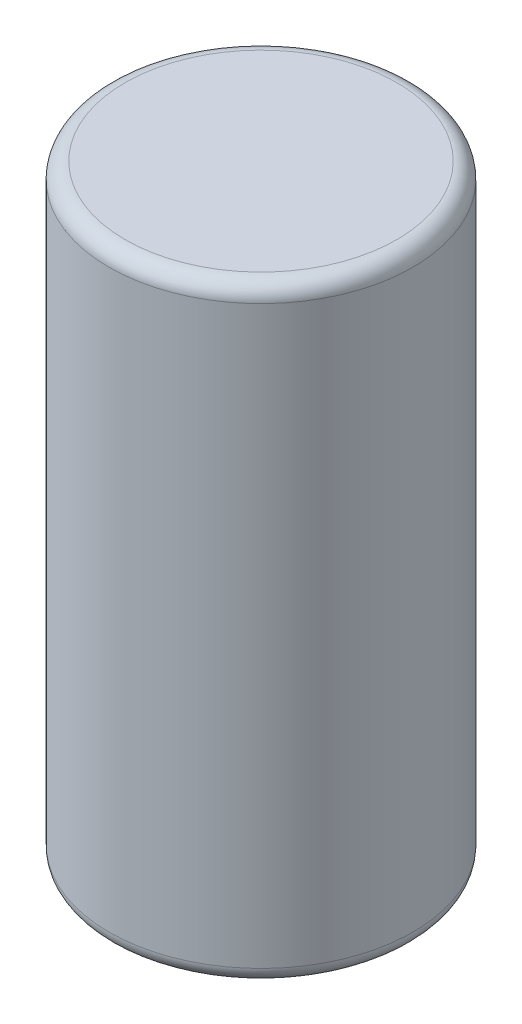
ISO-10303-21;
HEADER;
FILE_DESCRIPTION(('STEP AP214'),'2;1');
FILE_NAME('part.step','',(''),(''),'','','');
FILE_SCHEMA(('AUTOMOTIVE_DESIGN { 1 0 10303 214 1 1 1 1 }'));
ENDSEC;
DATA;
#1=APPLICATION_CONTEXT('core data for automotive mechanical design processes');
#2=APPLICATION_PROTOCOL_DEFINITION('international standard','automotive_design',2000,#1);
#3=PRODUCT_CONTEXT('',#1,'mechanical');
#4=PRODUCT('Part','Part','',(#3));
#5=PRODUCT_RELATED_PRODUCT_CATEGORY('part','',(#4));
#6=PRODUCT_DEFINITION_FORMATION('','',#4);
#7=PRODUCT_DEFINITION_CONTEXT('part definition',#1,'design');
#8=PRODUCT_DEFINITION('design','',#6,#7);
#9=PRODUCT_DEFINITION_SHAPE('','',#8);
#10=(LENGTH_UNIT() NAMED_UNIT(*) SI_UNIT(.MILLI.,.METRE.));
#11=(NAMED_UNIT(*) PLANE_ANGLE_UNIT() SI_UNIT($,.RADIAN.));
#12=(NAMED_UNIT(*) SI_UNIT($,.STERADIAN.) SOLID_ANGLE_UNIT());
#13=UNCERTAINTY_MEASURE_WITH_UNIT(LENGTH_MEASURE(1.E-05),#10,'distance_accuracy_value','');
#14=(GEOMETRIC_REPRESENTATION_CONTEXT(3) GLOBAL_UNCERTAINTY_ASSIGNED_CONTEXT((#13)) GLOBAL_UNIT_ASSIGNED_CONTEXT((#10,
#11,#12)) REPRESENTATION_CONTEXT('',''));
#15=CARTESIAN_POINT('',(0.,0.,0.));
#16=DIRECTION('',(0.,0.,1.));
#17=DIRECTION('',(1.,0.,0.));
#18=AXIS2_PLACEMENT_3D('',#15,#16,#17);
#19=CARTESIAN_POINT('',(0.,38.,0.));
#20=DIRECTION('',(0.,-1.,0.));
#21=DIRECTION('',(0.,0.,-1.));
#22=AXIS2_PLACEMENT_3D('',#19,#20,#21);
#23=CYLINDRICAL_SURFACE('',#22,9.5);
#24=CARTESIAN_POINT('',(0.,1.,0.));
#25=DIRECTION('',(0.,1.,0.));
#26=DIRECTION('',(0.,0.,1.));
#27=AXIS2_PLACEMENT_3D('',#24,#25,#26);
#28=CIRCLE('',#27,9.5);
#29=CARTESIAN_POINT('',(0.,1.,9.5));
#30=VERTEX_POINT('',#29);
#31=EDGE_CURVE('E52',#30,#30,#28,.T.);
#32=ORIENTED_EDGE('',*,*,#31,.T.);
#33=EDGE_LOOP('',(#32));
#34=FACE_BOUND('',#33,.T.);
#35=CARTESIAN_POINT('',(0.,37.,0.));
#36=DIRECTION('',(0.,1.,0.));
#37=DIRECTION('',(0.,0.,1.));
#38=AXIS2_PLACEMENT_3D('',#35,#36,#37);
#39=CIRCLE('',#38,9.5);
#40=CARTESIAN_POINT('',(0.,37.,9.5));
#41=VERTEX_POINT('',#40);
#42=EDGE_CURVE('E56',#41,#41,#39,.F.);
#43=ORIENTED_EDGE('',*,*,#42,.T.);
#44=EDGE_LOOP('',(#43));
#45=FACE_BOUND('',#44,.T.);
#46=ADVANCED_FACE('F41',(#34,#45),#23,.T.);
#47=CARTESIAN_POINT('',(0.,38.,0.));
#48=DIRECTION('',(0.,1.,0.));
#49=DIRECTION('',(0.,0.,1.));
#50=AXIS2_PLACEMENT_3D('',#47,#48,#49);
#51=PLANE('',#50);
#52=CARTESIAN_POINT('',(0.,38.,0.));
#53=DIRECTION('',(0.,1.,0.));
#54=DIRECTION('',(0.,0.,1.));
#55=AXIS2_PLACEMENT_3D('',#52,#53,#54);
#56=CIRCLE('',#55,8.5);
#57=CARTESIAN_POINT('',(0.,38.,8.5));
#58=VERTEX_POINT('',#57);
#59=EDGE_CURVE('E10',#58,#58,#56,.T.);
#60=ORIENTED_EDGE('',*,*,#59,.T.);
#61=EDGE_LOOP('',(#60));
#62=FACE_BOUND('',#61,.T.);
#63=ADVANCED_FACE('F72',(#62),#51,.T.);
#64=CARTESIAN_POINT('',(0.,0.,0.));
#65=DIRECTION('',(0.,1.,0.));
#66=DIRECTION('',(0.,0.,1.));
#67=AXIS2_PLACEMENT_3D('',#64,#65,#66);
#68=PLANE('',#67);
#69=CARTESIAN_POINT('',(0.,0.,0.));
#70=DIRECTION('',(0.,1.,0.));
#71=DIRECTION('',(0.,0.,1.));
#72=AXIS2_PLACEMENT_3D('',#69,#70,#71);
#73=CIRCLE('',#72,8.5);
#74=CARTESIAN_POINT('',(0.,0.,8.5));
#75=VERTEX_POINT('',#74);
#76=EDGE_CURVE('E48',#75,#75,#73,.F.);
#77=ORIENTED_EDGE('',*,*,#76,.T.);
#78=EDGE_LOOP('',(#77));
#79=FACE_BOUND('',#78,.T.);
#80=ADVANCED_FACE('F69',(#79),#68,.F.);
#81=CARTESIAN_POINT('',(0.,1.,0.));
#82=DIRECTION('',(0.,1.,0.));
#83=DIRECTION('',(0.,0.,1.));
#84=AXIS2_PLACEMENT_3D('',#81,#82,#83);
#85=TOROIDAL_SURFACE('',#84,8.5,1.);
#86=ORIENTED_EDGE('',*,*,#76,.F.);
#87=EDGE_LOOP('',(#86));
#88=FACE_BOUND('',#87,.T.);
#89=ORIENTED_EDGE('',*,*,#31,.F.);
#90=EDGE_LOOP('',(#89));
#91=FACE_BOUND('',#90,.T.);
#92=ADVANCED_FACE('F65',(#88,#91),#85,.T.);
#93=CARTESIAN_POINT('',(0.,37.,0.));
#94=DIRECTION('',(0.,1.,0.));
#95=DIRECTION('',(0.,0.,1.));
#96=AXIS2_PLACEMENT_3D('',#93,#94,#95);
#97=TOROIDAL_SURFACE('',#96,8.5,1.);
#98=ORIENTED_EDGE('',*,*,#42,.F.);
#99=EDGE_LOOP('',(#98));
#100=FACE_BOUND('',#99,.T.);
#101=ORIENTED_EDGE('',*,*,#59,.F.);
#102=EDGE_LOOP('',(#101));
#103=FACE_BOUND('',#102,.T.);
#104=ADVANCED_FACE('F43',(#100,#103),#97,.T.);
#105=CLOSED_SHELL('',(#46,#63,#80,#92,#104));
#106=MANIFOLD_SOLID_BREP('B2',#105);
#107=ADVANCED_BREP_SHAPE_REPRESENTATION('',(#18,#106),#14);
#108=SHAPE_DEFINITION_REPRESENTATION(#9,#107);
ENDSEC;
END-ISO-10303-21;
